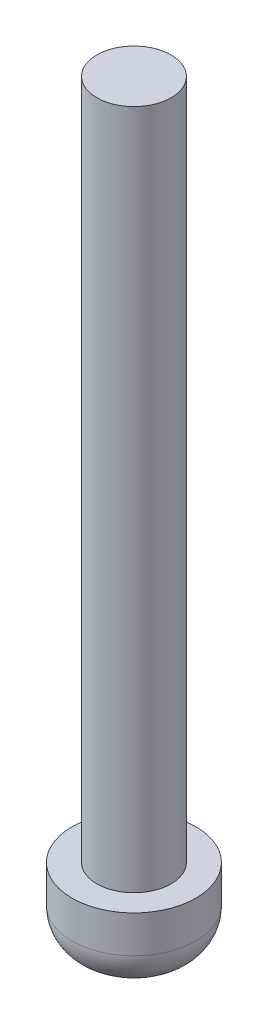
ISO-10303-21;
HEADER;
FILE_DESCRIPTION(('STEP AP214'),'2;1');
FILE_NAME('part.step','',(''),(''),'','','');
FILE_SCHEMA(('AUTOMOTIVE_DESIGN { 1 0 10303 214 1 1 1 1 }'));
ENDSEC;
DATA;
#1=APPLICATION_CONTEXT('core data for automotive mechanical design processes');
#2=APPLICATION_PROTOCOL_DEFINITION('international standard','automotive_design',2000,#1);
#3=PRODUCT_CONTEXT('',#1,'mechanical');
#4=PRODUCT('Part','Part','',(#3));
#5=PRODUCT_RELATED_PRODUCT_CATEGORY('part','',(#4));
#6=PRODUCT_DEFINITION_FORMATION('','',#4);
#7=PRODUCT_DEFINITION_CONTEXT('part definition',#1,'design');
#8=PRODUCT_DEFINITION('design','',#6,#7);
#9=PRODUCT_DEFINITION_SHAPE('','',#8);
#10=(LENGTH_UNIT() NAMED_UNIT(*) SI_UNIT(.MILLI.,.METRE.));
#11=(NAMED_UNIT(*) PLANE_ANGLE_UNIT() SI_UNIT($,.RADIAN.));
#12=(NAMED_UNIT(*) SI_UNIT($,.STERADIAN.) SOLID_ANGLE_UNIT());
#13=UNCERTAINTY_MEASURE_WITH_UNIT(LENGTH_MEASURE(1.E-05),#10,'distance_accuracy_value','');
#14=(GEOMETRIC_REPRESENTATION_CONTEXT(3) GLOBAL_UNCERTAINTY_ASSIGNED_CONTEXT((#13)) GLOBAL_UNIT_ASSIGNED_CONTEXT((#10,
#11,#12)) REPRESENTATION_CONTEXT('',''));
#15=CARTESIAN_POINT('',(0.,0.,0.));
#16=DIRECTION('',(0.,0.,1.));
#17=DIRECTION('',(1.,0.,0.));
#18=AXIS2_PLACEMENT_3D('',#15,#16,#17);
#19=CARTESIAN_POINT('',(0.,6.,0.));
#20=DIRECTION('',(0.,-1.,0.));
#21=DIRECTION('',(0.,0.,-1.));
#22=AXIS2_PLACEMENT_3D('',#19,#20,#21);
#23=CYLINDRICAL_SURFACE('',#22,5.);
#24=CARTESIAN_POINT('',(0.,3.,0.));
#25=DIRECTION('',(0.,1.,0.));
#26=DIRECTION('',(0.,0.,1.));
#27=AXIS2_PLACEMENT_3D('',#24,#25,#26);
#28=CIRCLE('',#27,5.);
#29=CARTESIAN_POINT('',(0.,3.,5.));
#30=VERTEX_POINT('',#29);
#31=EDGE_CURVE('E45',#30,#30,#28,.T.);
#32=ORIENTED_EDGE('',*,*,#31,.T.);
#33=EDGE_LOOP('',(#32));
#34=FACE_BOUND('',#33,.T.);
#35=CARTESIAN_POINT('',(0.,6.,0.));
#36=DIRECTION('',(0.,1.,0.));
#37=DIRECTION('',(0.,0.,1.));
#38=AXIS2_PLACEMENT_3D('',#35,#36,#37);
#39=CIRCLE('',#38,5.);
#40=CARTESIAN_POINT('',(0.,6.,5.));
#41=VERTEX_POINT('',#40);
#42=EDGE_CURVE('E55',#41,#41,#39,.T.);
#43=ORIENTED_EDGE('',*,*,#42,.F.);
#44=EDGE_LOOP('',(#43));
#45=FACE_BOUND('',#44,.T.);
#46=ADVANCED_FACE('F37',(#34,#45),#23,.T.);
#47=CARTESIAN_POINT('',(0.,6.,0.));
#48=DIRECTION('',(0.,1.,0.));
#49=DIRECTION('',(0.,0.,1.));
#50=AXIS2_PLACEMENT_3D('',#47,#48,#49);
#51=PLANE('',#50);
#52=CARTESIAN_POINT('',(0.,6.,0.));
#53=DIRECTION('',(0.,1.,0.));
#54=DIRECTION('',(0.,0.,1.));
#55=AXIS2_PLACEMENT_3D('',#52,#53,#54);
#56=CIRCLE('',#55,3.);
#57=CARTESIAN_POINT('',(0.,6.,3.));
#58=VERTEX_POINT('',#57);
#59=EDGE_CURVE('E50',#58,#58,#56,.T.);
#60=ORIENTED_EDGE('',*,*,#59,.F.);
#61=EDGE_LOOP('',(#60));
#62=FACE_BOUND('',#61,.T.);
#63=ORIENTED_EDGE('',*,*,#42,.T.);
#64=EDGE_LOOP('',(#63));
#65=FACE_BOUND('',#64,.T.);
#66=ADVANCED_FACE('F75',(#62,#65),#51,.T.);
#67=CARTESIAN_POINT('',(0.,0.,0.));
#68=DIRECTION('',(0.,1.,0.));
#69=DIRECTION('',(0.,0.,1.));
#70=AXIS2_PLACEMENT_3D('',#67,#68,#69);
#71=PLANE('',#70);
#72=CARTESIAN_POINT('',(0.,0.,0.));
#73=DIRECTION('',(0.,1.,0.));
#74=DIRECTION('',(0.,0.,1.));
#75=AXIS2_PLACEMENT_3D('',#72,#73,#74);
#76=CIRCLE('',#75,2.);
#77=CARTESIAN_POINT('',(0.,0.,2.));
#78=VERTEX_POINT('',#77);
#79=EDGE_CURVE('E10',#78,#78,#76,.F.);
#80=ORIENTED_EDGE('',*,*,#79,.T.);
#81=EDGE_LOOP('',(#80));
#82=FACE_BOUND('',#81,.T.);
#83=ADVANCED_FACE('F71',(#82),#71,.F.);
#84=CARTESIAN_POINT('',(0.,61.,0.));
#85=DIRECTION('',(0.,-1.,0.));
#86=DIRECTION('',(0.,0.,-1.));
#87=AXIS2_PLACEMENT_3D('',#84,#85,#86);
#88=CYLINDRICAL_SURFACE('',#87,3.);
#89=CARTESIAN_POINT('',(0.,61.,0.));
#90=DIRECTION('',(0.,1.,0.));
#91=DIRECTION('',(0.,0.,1.));
#92=AXIS2_PLACEMENT_3D('',#89,#90,#91);
#93=CIRCLE('',#92,3.);
#94=CARTESIAN_POINT('',(0.,61.,3.));
#95=VERTEX_POINT('',#94);
#96=EDGE_CURVE('E60',#95,#95,#93,.T.);
#97=ORIENTED_EDGE('',*,*,#96,.F.);
#98=EDGE_LOOP('',(#97));
#99=FACE_BOUND('',#98,.T.);
#100=ORIENTED_EDGE('',*,*,#59,.T.);
#101=EDGE_LOOP('',(#100));
#102=FACE_BOUND('',#101,.T.);
#103=ADVANCED_FACE('F68',(#99,#102),#88,.T.);
#104=CARTESIAN_POINT('',(0.,61.,0.));
#105=DIRECTION('',(0.,1.,0.));
#106=DIRECTION('',(0.,0.,1.));
#107=AXIS2_PLACEMENT_3D('',#104,#105,#106);
#108=PLANE('',#107);
#109=ORIENTED_EDGE('',*,*,#96,.T.);
#110=EDGE_LOOP('',(#109));
#111=FACE_BOUND('',#110,.T.);
#112=ADVANCED_FACE('F66',(#111),#108,.T.);
#113=CARTESIAN_POINT('',(0.,3.,0.));
#114=DIRECTION('',(0.,1.,0.));
#115=DIRECTION('',(0.,0.,1.));
#116=AXIS2_PLACEMENT_3D('',#113,#114,#115);
#117=DEGENERATE_TOROIDAL_SURFACE('',#116,2.,3.,.T.);
#118=ORIENTED_EDGE('',*,*,#79,.F.);
#119=EDGE_LOOP('',(#118));
#120=FACE_BOUND('',#119,.T.);
#121=ORIENTED_EDGE('',*,*,#31,.F.);
#122=EDGE_LOOP('',(#121));
#123=FACE_BOUND('',#122,.T.);
#124=ADVANCED_FACE('F39',(#120,#123),#117,.T.);
#125=CLOSED_SHELL('',(#46,#66,#83,#103,#112,#124));
#126=MANIFOLD_SOLID_BREP('B2',#125);
#127=ADVANCED_BREP_SHAPE_REPRESENTATION('',(#18,#126),#14);
#128=SHAPE_DEFINITION_REPRESENTATION(#9,#127);
ENDSEC;
END-ISO-10303-21;
